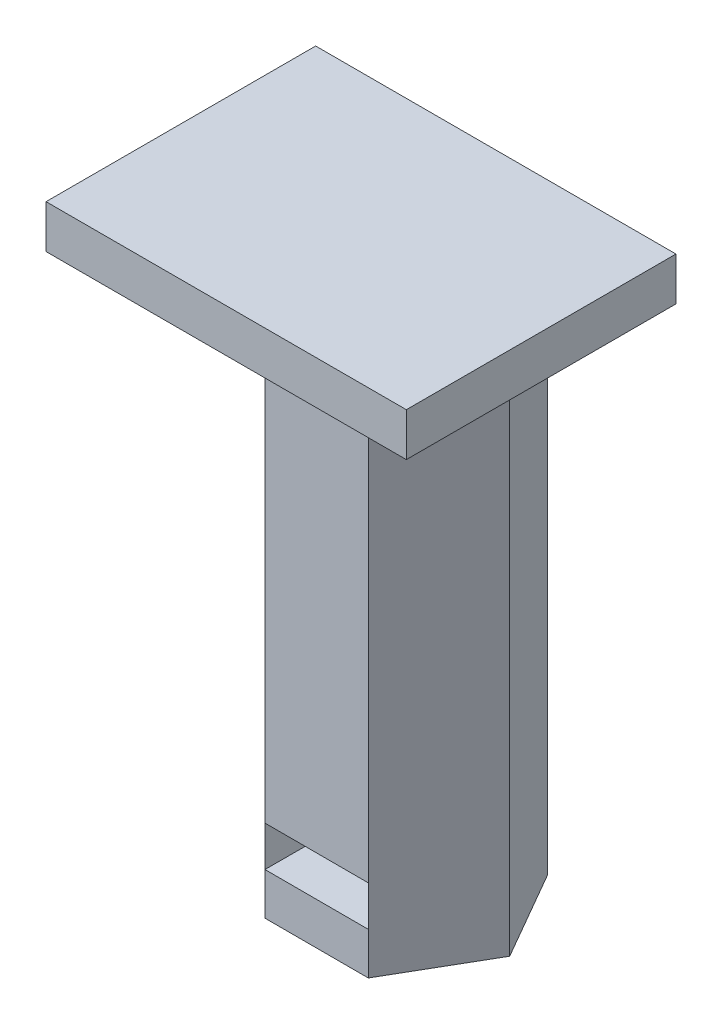
ISO-10303-21;
HEADER;
FILE_DESCRIPTION(('STEP AP214'),'2;1');
FILE_NAME('part.step','',(''),(''),'','','');
FILE_SCHEMA(('AUTOMOTIVE_DESIGN { 1 0 10303 214 1 1 1 1 }'));
ENDSEC;
DATA;
#1=APPLICATION_CONTEXT('core data for automotive mechanical design processes');
#2=APPLICATION_PROTOCOL_DEFINITION('international standard','automotive_design',2000,#1);
#3=PRODUCT_CONTEXT('',#1,'mechanical');
#4=PRODUCT('Part','Part','',(#3));
#5=PRODUCT_RELATED_PRODUCT_CATEGORY('part','',(#4));
#6=PRODUCT_DEFINITION_FORMATION('','',#4);
#7=PRODUCT_DEFINITION_CONTEXT('part definition',#1,'design');
#8=PRODUCT_DEFINITION('design','',#6,#7);
#9=PRODUCT_DEFINITION_SHAPE('','',#8);
#10=(LENGTH_UNIT() NAMED_UNIT(*) SI_UNIT(.MILLI.,.METRE.));
#11=(NAMED_UNIT(*) PLANE_ANGLE_UNIT() SI_UNIT($,.RADIAN.));
#12=(NAMED_UNIT(*) SI_UNIT($,.STERADIAN.) SOLID_ANGLE_UNIT());
#13=UNCERTAINTY_MEASURE_WITH_UNIT(LENGTH_MEASURE(1.E-05),#10,'distance_accuracy_value','');
#14=(GEOMETRIC_REPRESENTATION_CONTEXT(3) GLOBAL_UNCERTAINTY_ASSIGNED_CONTEXT((#13)) GLOBAL_UNIT_ASSIGNED_CONTEXT((#10,
#11,#12)) REPRESENTATION_CONTEXT('',''));
#15=CARTESIAN_POINT('',(0.,0.,0.));
#16=DIRECTION('',(0.,0.,1.));
#17=DIRECTION('',(1.,0.,0.));
#18=AXIS2_PLACEMENT_3D('',#15,#16,#17);
#19=CARTESIAN_POINT('',(17.6356304436922,-23.243149352119,0.0329205613525114));
#20=DIRECTION('',(-0.00114637727442172,0.,0.999999342909356));
#21=DIRECTION('',(0.999999342909357,0.,0.00114637727442172));
#22=AXIS2_PLACEMENT_3D('',#19,#20,#21);
#23=PLANE('',#22);
#24=DIRECTION('',(0.,1.,0.));
#25=VECTOR('',#24,1.);
#26=CARTESIAN_POINT('',(17.6356304436922,-23.243149352119,0.0329205613525114));
#27=LINE('',#26,#25);
#28=CARTESIAN_POINT('',(17.6356304436922,75.6246055057543,0.0329205613525114));
#29=VERTEX_POINT('',#28);
#30=CARTESIAN_POINT('',(17.6356304436922,207.756504416466,0.0329205613525114));
#31=VERTEX_POINT('',#30);
#32=EDGE_CURVE('E158',#29,#31,#27,.T.);
#33=ORIENTED_EDGE('',*,*,#32,.F.);
#34=DIRECTION('',(0.999999342909356,0.,0.00114637727442172));
#35=VECTOR('',#34,1.);
#36=CARTESIAN_POINT('',(17.6356304436922,75.6246055057544,0.0329205613525115));
#37=LINE('',#36,#35);
#38=CARTESIAN_POINT('',(-11.0813900828362,75.6246055057544,0.));
#39=VERTEX_POINT('',#38);
#40=EDGE_CURVE('E64',#39,#29,#37,.T.);
#41=ORIENTED_EDGE('',*,*,#40,.F.);
#42=DIRECTION('',(0.,1.,0.));
#43=VECTOR('',#42,1.);
#44=CARTESIAN_POINT('',(-11.0813900828362,-23.243149352119,0.));
#45=LINE('',#44,#43);
#46=CARTESIAN_POINT('',(-11.0813900828362,207.756504416466,0.));
#47=VERTEX_POINT('',#46);
#48=EDGE_CURVE('E205',#39,#47,#45,.T.);
#49=ORIENTED_EDGE('',*,*,#48,.T.);
#50=DIRECTION('',(0.999999342909356,0.,0.00114637727442172));
#51=VECTOR('',#50,1.);
#52=CARTESIAN_POINT('',(17.6356304436922,207.756504416466,0.0329205613525114));
#53=LINE('',#52,#51);
#54=EDGE_CURVE('E163',#47,#31,#53,.T.);
#55=ORIENTED_EDGE('',*,*,#54,.T.);
#56=EDGE_LOOP('',(#33,#41,#49,#55));
#57=FACE_BOUND('',#56,.T.);
#58=ADVANCED_FACE('F49',(#57),#23,.F.);
#59=CARTESIAN_POINT('',(-11.138410307467,-23.243149352119,49.7393384575844));
#60=DIRECTION('',(0.00114637727442187,0.,-0.999999342909356));
#61=DIRECTION('',(-0.999999342909357,0.,-0.00114637727442187));
#62=AXIS2_PLACEMENT_3D('',#59,#60,#61);
#63=PLANE('',#62);
#64=DIRECTION('',(0.,1.,0.));
#65=VECTOR('',#64,1.);
#66=CARTESIAN_POINT('',(-11.138410307467,-23.243149352119,49.7393384575844));
#67=LINE('',#66,#65);
#68=CARTESIAN_POINT('',(-11.1384101675563,75.6246055057544,49.7393384577448));
#69=VERTEX_POINT('',#68);
#70=CARTESIAN_POINT('',(-11.138410307467,207.756504416466,49.7393384575844));
#71=VERTEX_POINT('',#70);
#72=EDGE_CURVE('E179',#69,#71,#67,.T.);
#73=ORIENTED_EDGE('',*,*,#72,.F.);
#74=DIRECTION('',(0.999999342909357,0.,0.00114637727442187));
#75=VECTOR('',#74,1.);
#76=CARTESIAN_POINT('',(-11.138410307467,75.6246055057544,49.7393384575844));
#77=LINE('',#76,#75);
#78=CARTESIAN_POINT('',(17.5786103589721,75.6246055057544,49.7722590190973));
#79=VERTEX_POINT('',#78);
#80=EDGE_CURVE('E12',#69,#79,#77,.T.);
#81=ORIENTED_EDGE('',*,*,#80,.T.);
#82=DIRECTION('',(0.,1.,0.));
#83=VECTOR('',#82,1.);
#84=CARTESIAN_POINT('',(17.5786096238393,-23.243149352119,49.7722590182545));
#85=LINE('',#84,#83);
#86=CARTESIAN_POINT('',(17.5786096238393,207.756504416466,49.7722590182545));
#87=VERTEX_POINT('',#86);
#88=EDGE_CURVE('E174',#79,#87,#85,.T.);
#89=ORIENTED_EDGE('',*,*,#88,.T.);
#90=DIRECTION('',(-0.999999342909356,0.,-0.00114637727442187));
#91=VECTOR('',#90,1.);
#92=CARTESIAN_POINT('',(-11.138410307467,207.756504416466,49.7393384575844));
#93=LINE('',#92,#91);
#94=EDGE_CURVE('E172',#87,#71,#93,.T.);
#95=ORIENTED_EDGE('',*,*,#94,.T.);
#96=EDGE_LOOP('',(#73,#81,#89,#95));
#97=FACE_BOUND('',#96,.T.);
#98=ADVANCED_FACE('F252',(#97),#63,.F.);
#99=CARTESIAN_POINT('',(-25.468410924077,-23.243149352119,24.8532108962536));
#100=DIRECTION('',(0.86659799992084,0.,-0.49900692032596));
#101=DIRECTION('',(-0.49900692032596,0.,-0.86659799992084));
#102=AXIS2_PLACEMENT_3D('',#99,#100,#101);
#103=PLANE('',#102);
#104=DIRECTION('',(-0.49900692032596,0.,-0.86659799992084));
#105=VECTOR('',#104,1.);
#106=CARTESIAN_POINT('',(-25.468410924077,52.7564994990826,24.8532108962536));
#107=LINE('',#106,#105);
#108=CARTESIAN_POINT('',(-11.138410307467,52.7564994990826,49.7393384575844));
#109=VERTEX_POINT('',#108);
#110=CARTESIAN_POINT('',(-25.468410924077,52.7564994990825,24.8532108962536));
#111=VERTEX_POINT('',#110);
#112=EDGE_CURVE('E195',#109,#111,#107,.T.);
#113=ORIENTED_EDGE('',*,*,#112,.F.);
#114=CARTESIAN_POINT('',(-11.138410307467,64.4552667918614,49.7393384575844));
#115=VERTEX_POINT('',#114);
#116=EDGE_CURVE('E175',#109,#115,#67,.T.);
#117=ORIENTED_EDGE('',*,*,#116,.T.);
#118=EDGE_CURVE('E178',#115,#69,#67,.T.);
#119=ORIENTED_EDGE('',*,*,#118,.T.);
#120=ORIENTED_EDGE('',*,*,#72,.T.);
#121=DIRECTION('',(-0.49900692032596,0.,-0.86659799992084));
#122=VECTOR('',#121,1.);
#123=CARTESIAN_POINT('',(-25.468410924077,207.756504416466,24.8532108962536));
#124=LINE('',#123,#122);
#125=CARTESIAN_POINT('',(-25.468410924077,207.756504416466,24.8532108962536));
#126=VERTEX_POINT('',#125);
#127=EDGE_CURVE('E177',#71,#126,#124,.T.);
#128=ORIENTED_EDGE('',*,*,#127,.T.);
#129=DIRECTION('',(0.,1.,0.));
#130=VECTOR('',#129,1.);
#131=CARTESIAN_POINT('',(-25.468410924077,-23.243149352119,24.8532108962536));
#132=LINE('',#131,#130);
#133=EDGE_CURVE('E199',#111,#126,#132,.T.);
#134=ORIENTED_EDGE('',*,*,#133,.F.);
#135=EDGE_LOOP('',(#113,#117,#119,#120,#128,#134));
#136=FACE_BOUND('',#135,.T.);
#137=ADVANCED_FACE('F210',(#136),#103,.F.);
#138=CARTESIAN_POINT('',(-11.0813900828362,-23.243149352119,0.));
#139=DIRECTION('',(0.86545165443545,0.,0.500992448880162));
#140=DIRECTION('',(0.500992448880163,0.,-0.86545165443545));
#141=AXIS2_PLACEMENT_3D('',#138,#139,#140);
#142=PLANE('',#141);
#143=DIRECTION('',(0.500992448880163,0.,-0.86545165443545));
#144=VECTOR('',#143,1.);
#145=CARTESIAN_POINT('',(-11.0813900828362,52.7564994990826,0.));
#146=LINE('',#145,#144);
#147=CARTESIAN_POINT('',(-11.0813900828362,52.7564994990825,0.));
#148=VERTEX_POINT('',#147);
#149=EDGE_CURVE('E192',#111,#148,#146,.T.);
#150=ORIENTED_EDGE('',*,*,#149,.F.);
#151=ORIENTED_EDGE('',*,*,#133,.T.);
#152=DIRECTION('',(0.500992448880163,0.,-0.86545165443545));
#153=VECTOR('',#152,1.);
#154=CARTESIAN_POINT('',(-11.0813900828362,207.756504416466,0.));
#155=LINE('',#154,#153);
#156=EDGE_CURVE('E200',#126,#47,#155,.T.);
#157=ORIENTED_EDGE('',*,*,#156,.T.);
#158=ORIENTED_EDGE('',*,*,#48,.F.);
#159=DIRECTION('',(0.,1.,0.));
#160=VECTOR('',#159,1.);
#161=CARTESIAN_POINT('',(-11.0813900828362,75.6246055057544,0.));
#162=LINE('',#161,#160);
#163=CARTESIAN_POINT('',(-11.0813900828362,64.4552667918614,0.));
#164=VERTEX_POINT('',#163);
#165=EDGE_CURVE('E151',#164,#39,#162,.T.);
#166=ORIENTED_EDGE('',*,*,#165,.F.);
#167=EDGE_CURVE('E150',#148,#164,#45,.T.);
#168=ORIENTED_EDGE('',*,*,#167,.F.);
#169=EDGE_LOOP('',(#150,#151,#157,#158,#166,#168));
#170=FACE_BOUND('',#169,.T.);
#171=ADVANCED_FACE('F222',(#170),#142,.F.);
#172=ORIENTED_EDGE('',*,*,#167,.T.);
#173=DIRECTION('',(-0.999999342909356,0.,-0.00114637727442172));
#174=VECTOR('',#173,1.);
#175=CARTESIAN_POINT('',(17.6356304436922,64.4552667918614,0.0329205613525115));
#176=LINE('',#175,#174);
#177=CARTESIAN_POINT('',(17.6356304436922,64.4552667918614,0.0329205613525115));
#178=VERTEX_POINT('',#177);
#179=EDGE_CURVE('E129',#178,#164,#176,.T.);
#180=ORIENTED_EDGE('',*,*,#179,.F.);
#181=CARTESIAN_POINT('',(17.6356304436922,52.7564994990825,0.0329205613525114));
#182=VERTEX_POINT('',#181);
#183=EDGE_CURVE('E147',#182,#178,#27,.T.);
#184=ORIENTED_EDGE('',*,*,#183,.F.);
#185=DIRECTION('',(0.999999342909357,0.,0.00114637727442172));
#186=VECTOR('',#185,1.);
#187=CARTESIAN_POINT('',(17.6356304436922,52.7564994990826,0.0329205613525114));
#188=LINE('',#187,#186);
#189=EDGE_CURVE('E186',#148,#182,#188,.T.);
#190=ORIENTED_EDGE('',*,*,#189,.F.);
#191=EDGE_LOOP('',(#172,#180,#184,#190));
#192=FACE_BOUND('',#191,.T.);
#193=ADVANCED_FACE('F146',(#192),#23,.F.);
#194=CARTESIAN_POINT('',(31.9656282663345,-23.243149352119,24.9190498143435));
#195=DIRECTION('',(-0.866598056662609,0.,0.499006821785624));
#196=DIRECTION('',(0.499006821785624,0.,0.866598056662609));
#197=AXIS2_PLACEMENT_3D('',#194,#195,#196);
#198=PLANE('',#197);
#199=DIRECTION('',(0.499006821785624,0.,0.866598056662609));
#200=VECTOR('',#199,1.);
#201=CARTESIAN_POINT('',(31.9656282663345,52.7564994990826,24.9190498143435));
#202=LINE('',#201,#200);
#203=CARTESIAN_POINT('',(31.9656282663345,52.7564994990825,24.9190498143435));
#204=VERTEX_POINT('',#203);
#205=EDGE_CURVE('E156',#182,#204,#202,.T.);
#206=ORIENTED_EDGE('',*,*,#205,.F.);
#207=ORIENTED_EDGE('',*,*,#183,.T.);
#208=DIRECTION('',(0.,-1.,0.));
#209=VECTOR('',#208,1.);
#210=CARTESIAN_POINT('',(17.6356304436922,75.6246055057544,0.0329205613525115));
#211=LINE('',#210,#209);
#212=EDGE_CURVE('E136',#29,#178,#211,.T.);
#213=ORIENTED_EDGE('',*,*,#212,.F.);
#214=ORIENTED_EDGE('',*,*,#32,.T.);
#215=DIRECTION('',(0.499006821785624,0.,0.866598056662609));
#216=VECTOR('',#215,1.);
#217=CARTESIAN_POINT('',(31.9656282663345,207.756504416466,24.9190498143435));
#218=LINE('',#217,#216);
#219=CARTESIAN_POINT('',(31.9656282663345,207.756504416466,24.9190498143435));
#220=VERTEX_POINT('',#219);
#221=EDGE_CURVE('E157',#31,#220,#218,.T.);
#222=ORIENTED_EDGE('',*,*,#221,.T.);
#223=DIRECTION('',(0.,1.,0.));
#224=VECTOR('',#223,1.);
#225=CARTESIAN_POINT('',(31.9656282663345,-23.243149352119,24.9190498143435));
#226=LINE('',#225,#224);
#227=EDGE_CURVE('E161',#204,#220,#226,.T.);
#228=ORIENTED_EDGE('',*,*,#227,.F.);
#229=EDGE_LOOP('',(#206,#207,#213,#214,#222,#228));
#230=FACE_BOUND('',#229,.T.);
#231=ADVANCED_FACE('F153',(#230),#198,.F.);
#232=CARTESIAN_POINT('',(17.5786096238393,-23.243149352119,49.7722590182545));
#233=DIRECTION('',(-0.865451672841794,0.,-0.500992417083671));
#234=DIRECTION('',(-0.500992417083672,0.,0.865451672841795));
#235=AXIS2_PLACEMENT_3D('',#232,#233,#234);
#236=PLANE('',#235);
#237=DIRECTION('',(-0.500992417083672,0.,0.865451672841795));
#238=VECTOR('',#237,1.);
#239=CARTESIAN_POINT('',(17.5786096238393,52.7564994990826,49.7722590182545));
#240=LINE('',#239,#238);
#241=CARTESIAN_POINT('',(17.5786096238393,52.7564994990825,49.7722590182545));
#242=VERTEX_POINT('',#241);
#243=EDGE_CURVE('E180',#204,#242,#240,.T.);
#244=ORIENTED_EDGE('',*,*,#243,.F.);
#245=ORIENTED_EDGE('',*,*,#227,.T.);
#246=DIRECTION('',(-0.500992417083671,0.,0.865451672841794));
#247=VECTOR('',#246,1.);
#248=CARTESIAN_POINT('',(17.5786096238393,207.756504416466,49.7722590182545));
#249=LINE('',#248,#247);
#250=EDGE_CURVE('E168',#220,#87,#249,.T.);
#251=ORIENTED_EDGE('',*,*,#250,.T.);
#252=ORIENTED_EDGE('',*,*,#88,.F.);
#253=CARTESIAN_POINT('',(17.5786103589721,64.4552667918614,49.7722590190973));
#254=VERTEX_POINT('',#253);
#255=EDGE_CURVE('E173',#254,#79,#85,.T.);
#256=ORIENTED_EDGE('',*,*,#255,.F.);
#257=EDGE_CURVE('E169',#242,#254,#85,.T.);
#258=ORIENTED_EDGE('',*,*,#257,.F.);
#259=EDGE_LOOP('',(#244,#245,#251,#252,#256,#258));
#260=FACE_BOUND('',#259,.T.);
#261=ADVANCED_FACE('F240',(#260),#236,.F.);
#262=ORIENTED_EDGE('',*,*,#257,.T.);
#263=DIRECTION('',(-0.999999342909357,0.,-0.00114637727442187));
#264=VECTOR('',#263,1.);
#265=CARTESIAN_POINT('',(-11.138410307467,64.4552667918614,49.7393384575844));
#266=LINE('',#265,#264);
#267=EDGE_CURVE('E57',#254,#115,#266,.T.);
#268=ORIENTED_EDGE('',*,*,#267,.T.);
#269=ORIENTED_EDGE('',*,*,#116,.F.);
#270=DIRECTION('',(-0.999999342909357,0.,-0.00114637727442187));
#271=VECTOR('',#270,1.);
#272=CARTESIAN_POINT('',(-11.138410307467,52.7564994990826,49.7393384575844));
#273=LINE('',#272,#271);
#274=EDGE_CURVE('E198',#242,#109,#273,.T.);
#275=ORIENTED_EDGE('',*,*,#274,.F.);
#276=EDGE_LOOP('',(#262,#268,#269,#275));
#277=FACE_BOUND('',#276,.T.);
#278=ADVANCED_FACE('F242',(#277),#63,.F.);
#279=CARTESIAN_POINT('',(0.,207.756504416466,0.));
#280=DIRECTION('',(0.,-1.,0.));
#281=DIRECTION('',(0.,0.,-1.));
#282=AXIS2_PLACEMENT_3D('',#279,#280,#281);
#283=PLANE('',#282);
#284=ORIENTED_EDGE('',*,*,#127,.F.);
#285=ORIENTED_EDGE('',*,*,#94,.F.);
#286=ORIENTED_EDGE('',*,*,#250,.F.);
#287=ORIENTED_EDGE('',*,*,#221,.F.);
#288=ORIENTED_EDGE('',*,*,#54,.F.);
#289=ORIENTED_EDGE('',*,*,#156,.F.);
#290=EDGE_LOOP('',(#284,#285,#286,#287,#288,#289));
#291=FACE_BOUND('',#290,.T.);
#292=ADVANCED_FACE('F216',(#291),#283,.F.);
#293=CARTESIAN_POINT('',(0.,52.7564994990826,0.));
#294=DIRECTION('',(0.,-1.,0.));
#295=DIRECTION('',(0.,0.,-1.));
#296=AXIS2_PLACEMENT_3D('',#293,#294,#295);
#297=PLANE('',#296);
#298=ORIENTED_EDGE('',*,*,#274,.T.);
#299=ORIENTED_EDGE('',*,*,#112,.T.);
#300=ORIENTED_EDGE('',*,*,#149,.T.);
#301=ORIENTED_EDGE('',*,*,#189,.T.);
#302=ORIENTED_EDGE('',*,*,#205,.T.);
#303=ORIENTED_EDGE('',*,*,#243,.T.);
#304=EDGE_LOOP('',(#298,#299,#300,#301,#302,#303));
#305=FACE_BOUND('',#304,.T.);
#306=ADVANCED_FACE('F51',(#305),#297,.T.);
#307=CARTESIAN_POINT('',(17.5497358676096,75.6246055057544,74.9598417055495));
#308=DIRECTION('',(0.999999342909356,0.,0.00114637727442172));
#309=DIRECTION('',(0.00114637727442172,0.,-0.999999342909357));
#310=AXIS2_PLACEMENT_3D('',#307,#308,#309);
#311=PLANE('',#310);
#312=DIRECTION('',(0.00114637727442172,0.,-0.999999342909356));
#313=VECTOR('',#312,1.);
#314=CARTESIAN_POINT('',(17.5497358676096,75.6246055057544,74.9598417055495));
#315=LINE('',#314,#313);
#316=EDGE_CURVE('E138',#79,#29,#315,.T.);
#317=ORIENTED_EDGE('',*,*,#316,.T.);
#318=ORIENTED_EDGE('',*,*,#212,.T.);
#319=DIRECTION('',(0.00114637727442172,0.,-0.999999342909356));
#320=VECTOR('',#319,1.);
#321=CARTESIAN_POINT('',(17.5497358676096,64.4552667918614,74.9598417055495));
#322=LINE('',#321,#320);
#323=EDGE_CURVE('E125',#254,#178,#322,.T.);
#324=ORIENTED_EDGE('',*,*,#323,.F.);
#325=ORIENTED_EDGE('',*,*,#255,.T.);
#326=EDGE_LOOP('',(#317,#318,#324,#325));
#327=FACE_BOUND('',#326,.T.);
#328=ADVANCED_FACE('F137',(#327),#311,.F.);
#329=CARTESIAN_POINT('',(17.5497358676096,75.6246055057544,74.9598417055495));
#330=DIRECTION('',(0.,1.,0.));
#331=DIRECTION('',(0.,0.,1.));
#332=AXIS2_PLACEMENT_3D('',#329,#330,#331);
#333=PLANE('',#332);
#334=DIRECTION('',(0.00114637727442172,0.,-0.999999342909356));
#335=VECTOR('',#334,1.);
#336=CARTESIAN_POINT('',(-11.1672846589188,75.6246055057544,74.926921144197));
#337=LINE('',#336,#335);
#338=EDGE_CURVE('E231',#69,#39,#337,.T.);
#339=ORIENTED_EDGE('',*,*,#338,.T.);
#340=ORIENTED_EDGE('',*,*,#40,.T.);
#341=ORIENTED_EDGE('',*,*,#316,.F.);
#342=ORIENTED_EDGE('',*,*,#80,.F.);
#343=EDGE_LOOP('',(#339,#340,#341,#342));
#344=FACE_BOUND('',#343,.T.);
#345=ADVANCED_FACE('F248',(#344),#333,.F.);
#346=CARTESIAN_POINT('',(-11.1672846589188,75.6246055057544,74.926921144197));
#347=DIRECTION('',(-0.999999342909356,0.,-0.00114637727442172));
#348=DIRECTION('',(-0.00114637727442172,0.,0.999999342909357));
#349=AXIS2_PLACEMENT_3D('',#346,#347,#348);
#350=PLANE('',#349);
#351=DIRECTION('',(0.00114637727442172,0.,-0.999999342909356));
#352=VECTOR('',#351,1.);
#353=CARTESIAN_POINT('',(-11.1672846589188,64.4552667918614,74.926921144197));
#354=LINE('',#353,#352);
#355=EDGE_CURVE('E72',#115,#164,#354,.T.);
#356=ORIENTED_EDGE('',*,*,#355,.T.);
#357=ORIENTED_EDGE('',*,*,#165,.T.);
#358=ORIENTED_EDGE('',*,*,#338,.F.);
#359=ORIENTED_EDGE('',*,*,#118,.F.);
#360=EDGE_LOOP('',(#356,#357,#358,#359));
#361=FACE_BOUND('',#360,.T.);
#362=ADVANCED_FACE('F237',(#361),#350,.F.);
#363=CARTESIAN_POINT('',(17.5497358676096,64.4552667918614,74.9598417055495));
#364=DIRECTION('',(0.,-1.,0.));
#365=DIRECTION('',(0.,0.,-1.));
#366=AXIS2_PLACEMENT_3D('',#363,#364,#365);
#367=PLANE('',#366);
#368=ORIENTED_EDGE('',*,*,#323,.T.);
#369=ORIENTED_EDGE('',*,*,#179,.T.);
#370=ORIENTED_EDGE('',*,*,#355,.F.);
#371=ORIENTED_EDGE('',*,*,#267,.F.);
#372=EDGE_LOOP('',(#368,#369,#370,#371));
#373=FACE_BOUND('',#372,.T.);
#374=ADVANCED_FACE('F127',(#373),#367,.F.);
#375=CLOSED_SHELL('',(#58,#98,#137,#171,#193,#231,#261,#278,#292,#306,#328,#345,#362,#374));
#376=MANIFOLD_SOLID_BREP('B2',#375);
#377=CARTESIAN_POINT('',(-46.7513911426067,344.657945666358,74.8861283063889));
#378=DIRECTION('',(-1.,0.,0.));
#379=DIRECTION('',(0.,0.,1.));
#380=AXIS2_PLACEMENT_3D('',#377,#378,#379);
#381=PLANE('',#380);
#382=DIRECTION('',(0.,0.,1.));
#383=VECTOR('',#382,1.);
#384=CARTESIAN_POINT('',(-46.7513911426067,219.756498932838,74.8861283063889));
#385=LINE('',#384,#383);
#386=CARTESIAN_POINT('',(-46.7513911426067,219.756498932838,0.0505011084896978));
#387=VERTEX_POINT('',#386);
#388=CARTESIAN_POINT('',(-46.7513911426067,219.756498932838,74.8861283063889));
#389=VERTEX_POINT('',#388);
#390=EDGE_CURVE('E393',#387,#389,#385,.T.);
#391=ORIENTED_EDGE('',*,*,#390,.F.);
#392=DIRECTION('',(0.,-1.,0.));
#393=VECTOR('',#392,1.);
#394=CARTESIAN_POINT('',(-46.7513911426067,344.657945666358,0.0505011084896978));
#395=LINE('',#394,#393);
#396=CARTESIAN_POINT('',(-46.7513911426067,207.756504416466,0.0505011084896978));
#397=VERTEX_POINT('',#396);
#398=EDGE_CURVE('E421',#387,#397,#395,.T.);
#399=ORIENTED_EDGE('',*,*,#398,.T.);
#400=DIRECTION('',(0.,0.,-1.));
#401=VECTOR('',#400,1.);
#402=CARTESIAN_POINT('',(-46.7513911426067,207.756504416466,74.8861283063889));
#403=LINE('',#402,#401);
#404=CARTESIAN_POINT('',(-46.7513911426067,207.756504416466,74.8861283063889));
#405=VERTEX_POINT('',#404);
#406=EDGE_CURVE('E425',#405,#397,#403,.T.);
#407=ORIENTED_EDGE('',*,*,#406,.F.);
#408=DIRECTION('',(0.,-1.,0.));
#409=VECTOR('',#408,1.);
#410=CARTESIAN_POINT('',(-46.7513911426067,344.657945666358,74.8861283063889));
#411=LINE('',#410,#409);
#412=EDGE_CURVE('E448',#389,#405,#411,.T.);
#413=ORIENTED_EDGE('',*,*,#412,.F.);
#414=EDGE_LOOP('',(#391,#399,#407,#413));
#415=FACE_BOUND('',#414,.T.);
#416=ADVANCED_FACE('F385',(#415),#381,.T.);
#417=CARTESIAN_POINT('',(-46.7513911426067,344.657945666358,74.8861283063889));
#418=DIRECTION('',(0.,0.,1.));
#419=DIRECTION('',(1.,0.,0.));
#420=AXIS2_PLACEMENT_3D('',#417,#418,#419);
#421=PLANE('',#420);
#422=DIRECTION('',(1.,0.,0.));
#423=VECTOR('',#422,1.);
#424=CARTESIAN_POINT('',(-46.7513911426067,219.756498932838,74.8861283063889));
#425=LINE('',#424,#423);
#426=CARTESIAN_POINT('',(53.2486103475094,219.756498932838,74.8861283063889));
#427=VERTEX_POINT('',#426);
#428=EDGE_CURVE('E399',#389,#427,#425,.T.);
#429=ORIENTED_EDGE('',*,*,#428,.F.);
#430=ORIENTED_EDGE('',*,*,#412,.T.);
#431=DIRECTION('',(-1.,0.,0.));
#432=VECTOR('',#431,1.);
#433=CARTESIAN_POINT('',(-46.7513911426067,207.756504416466,74.8861283063889));
#434=LINE('',#433,#432);
#435=CARTESIAN_POINT('',(53.2486103475094,207.756504416466,74.8861283063889));
#436=VERTEX_POINT('',#435);
#437=EDGE_CURVE('E430',#436,#405,#434,.T.);
#438=ORIENTED_EDGE('',*,*,#437,.F.);
#439=DIRECTION('',(0.,-1.,0.));
#440=VECTOR('',#439,1.);
#441=CARTESIAN_POINT('',(53.2486103475094,344.657945666358,74.8861283063889));
#442=LINE('',#441,#440);
#443=EDGE_CURVE('E451',#427,#436,#442,.T.);
#444=ORIENTED_EDGE('',*,*,#443,.F.);
#445=EDGE_LOOP('',(#429,#430,#438,#444));
#446=FACE_BOUND('',#445,.T.);
#447=ADVANCED_FACE('F457',(#446),#421,.T.);
#448=CARTESIAN_POINT('',(53.2486103475094,344.657945666358,74.8861283063889));
#449=DIRECTION('',(1.,0.,0.));
#450=DIRECTION('',(0.,0.,-1.));
#451=AXIS2_PLACEMENT_3D('',#448,#449,#450);
#452=PLANE('',#451);
#453=DIRECTION('',(0.,0.,-1.));
#454=VECTOR('',#453,1.);
#455=CARTESIAN_POINT('',(53.2486103475094,219.756498932838,74.8861283063889));
#456=LINE('',#455,#454);
#457=CARTESIAN_POINT('',(53.2486103475094,219.756498932838,0.0505011084896978));
#458=VERTEX_POINT('',#457);
#459=EDGE_CURVE('E450',#427,#458,#456,.T.);
#460=ORIENTED_EDGE('',*,*,#459,.F.);
#461=ORIENTED_EDGE('',*,*,#443,.T.);
#462=DIRECTION('',(0.,0.,1.));
#463=VECTOR('',#462,1.);
#464=CARTESIAN_POINT('',(53.2486103475094,207.756504416466,74.8861283063889));
#465=LINE('',#464,#463);
#466=CARTESIAN_POINT('',(53.2486103475094,207.756504416466,0.0505011084896978));
#467=VERTEX_POINT('',#466);
#468=EDGE_CURVE('E438',#467,#436,#465,.T.);
#469=ORIENTED_EDGE('',*,*,#468,.F.);
#470=DIRECTION('',(0.,-1.,0.));
#471=VECTOR('',#470,1.);
#472=CARTESIAN_POINT('',(53.2486103475094,344.657945666358,0.0505011084896978));
#473=LINE('',#472,#471);
#474=EDGE_CURVE('E429',#458,#467,#473,.T.);
#475=ORIENTED_EDGE('',*,*,#474,.F.);
#476=EDGE_LOOP('',(#460,#461,#469,#475));
#477=FACE_BOUND('',#476,.T.);
#478=ADVANCED_FACE('F455',(#477),#452,.T.);
#479=CARTESIAN_POINT('',(-46.7513911426067,344.657945666358,0.0505011084896978));
#480=DIRECTION('',(0.,0.,-1.));
#481=DIRECTION('',(-1.,0.,0.));
#482=AXIS2_PLACEMENT_3D('',#479,#480,#481);
#483=PLANE('',#482);
#484=DIRECTION('',(-1.,0.,0.));
#485=VECTOR('',#484,1.);
#486=CARTESIAN_POINT('',(-46.7513911426067,219.756498932838,0.0505011084896978));
#487=LINE('',#486,#485);
#488=EDGE_CURVE('E47',#458,#387,#487,.T.);
#489=ORIENTED_EDGE('',*,*,#488,.F.);
#490=ORIENTED_EDGE('',*,*,#474,.T.);
#491=DIRECTION('',(1.,0.,0.));
#492=VECTOR('',#491,1.);
#493=CARTESIAN_POINT('',(-46.7513911426067,207.756504416466,0.0505011084896978));
#494=LINE('',#493,#492);
#495=EDGE_CURVE('E432',#397,#467,#494,.T.);
#496=ORIENTED_EDGE('',*,*,#495,.F.);
#497=ORIENTED_EDGE('',*,*,#398,.F.);
#498=EDGE_LOOP('',(#489,#490,#496,#497));
#499=FACE_BOUND('',#498,.T.);
#500=ADVANCED_FACE('F433',(#499),#483,.T.);
#501=CARTESIAN_POINT('',(0.,207.756504416466,0.));
#502=DIRECTION('',(0.,-1.,0.));
#503=DIRECTION('',(0.,0.,-1.));
#504=AXIS2_PLACEMENT_3D('',#501,#502,#503);
#505=PLANE('',#504);
#506=ORIENTED_EDGE('',*,*,#406,.T.);
#507=ORIENTED_EDGE('',*,*,#495,.T.);
#508=ORIENTED_EDGE('',*,*,#468,.T.);
#509=ORIENTED_EDGE('',*,*,#437,.T.);
#510=EDGE_LOOP('',(#506,#507,#508,#509));
#511=FACE_BOUND('',#510,.T.);
#512=ADVANCED_FACE('F440',(#511),#505,.T.);
#513=CARTESIAN_POINT('',(0.,219.756498932838,0.));
#514=DIRECTION('',(0.,-1.,0.));
#515=DIRECTION('',(0.,0.,-1.));
#516=AXIS2_PLACEMENT_3D('',#513,#514,#515);
#517=PLANE('',#516);
#518=ORIENTED_EDGE('',*,*,#390,.T.);
#519=ORIENTED_EDGE('',*,*,#428,.T.);
#520=ORIENTED_EDGE('',*,*,#459,.T.);
#521=ORIENTED_EDGE('',*,*,#488,.T.);
#522=EDGE_LOOP('',(#518,#519,#520,#521));
#523=FACE_BOUND('',#522,.T.);
#524=ADVANCED_FACE('F459',(#523),#517,.F.);
#525=CLOSED_SHELL('',(#416,#447,#478,#500,#512,#524));
#526=MANIFOLD_SOLID_BREP('B6',#525);
#527=ADVANCED_BREP_SHAPE_REPRESENTATION('',(#18,#376,#526),#14);
#528=SHAPE_DEFINITION_REPRESENTATION(#9,#527);
ENDSEC;
END-ISO-10303-21;
